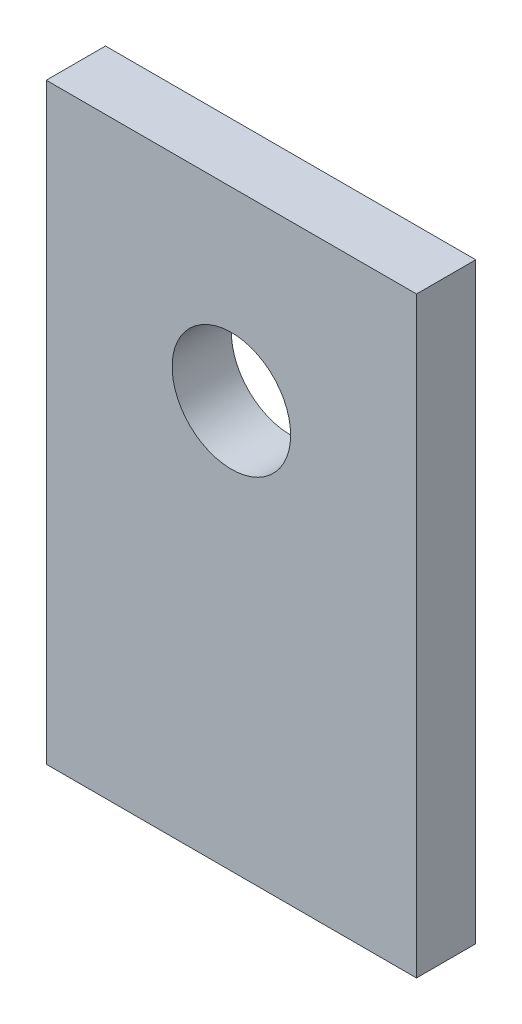
ISO-10303-21;
HEADER;
FILE_DESCRIPTION(('STEP AP214'),'2;1');
FILE_NAME('part.step','',(''),(''),'','','');
FILE_SCHEMA(('AUTOMOTIVE_DESIGN { 1 0 10303 214 1 1 1 1 }'));
ENDSEC;
DATA;
#1=APPLICATION_CONTEXT('core data for automotive mechanical design processes');
#2=APPLICATION_PROTOCOL_DEFINITION('international standard','automotive_design',2000,#1);
#3=PRODUCT_CONTEXT('',#1,'mechanical');
#4=PRODUCT('Part','Part','',(#3));
#5=PRODUCT_RELATED_PRODUCT_CATEGORY('part','',(#4));
#6=PRODUCT_DEFINITION_FORMATION('','',#4);
#7=PRODUCT_DEFINITION_CONTEXT('part definition',#1,'design');
#8=PRODUCT_DEFINITION('design','',#6,#7);
#9=PRODUCT_DEFINITION_SHAPE('','',#8);
#10=(LENGTH_UNIT() NAMED_UNIT(*) SI_UNIT(.MILLI.,.METRE.));
#11=(NAMED_UNIT(*) PLANE_ANGLE_UNIT() SI_UNIT($,.RADIAN.));
#12=(NAMED_UNIT(*) SI_UNIT($,.STERADIAN.) SOLID_ANGLE_UNIT());
#13=UNCERTAINTY_MEASURE_WITH_UNIT(LENGTH_MEASURE(1.E-05),#10,'distance_accuracy_value','');
#14=(GEOMETRIC_REPRESENTATION_CONTEXT(3) GLOBAL_UNCERTAINTY_ASSIGNED_CONTEXT((#13)) GLOBAL_UNIT_ASSIGNED_CONTEXT((#10,
#11,#12)) REPRESENTATION_CONTEXT('',''));
#15=CARTESIAN_POINT('',(0.,0.,0.));
#16=DIRECTION('',(0.,0.,1.));
#17=DIRECTION('',(1.,0.,0.));
#18=AXIS2_PLACEMENT_3D('',#15,#16,#17);
#19=CARTESIAN_POINT('',(0.,0.,4.));
#20=DIRECTION('',(0.,0.,1.));
#21=DIRECTION('',(1.,0.,0.));
#22=AXIS2_PLACEMENT_3D('',#19,#20,#21);
#23=PLANE('',#22);
#24=DIRECTION('',(0.,1.,0.));
#25=VECTOR('',#24,1.);
#26=CARTESIAN_POINT('',(12.5,20.,4.));
#27=LINE('',#26,#25);
#28=CARTESIAN_POINT('',(12.5,-20.,4.));
#29=VERTEX_POINT('',#28);
#30=CARTESIAN_POINT('',(12.5,20.,4.));
#31=VERTEX_POINT('',#30);
#32=EDGE_CURVE('E92',#29,#31,#27,.T.);
#33=ORIENTED_EDGE('',*,*,#32,.T.);
#34=DIRECTION('',(-1.,0.,0.));
#35=VECTOR('',#34,1.);
#36=CARTESIAN_POINT('',(-12.5,20.,4.));
#37=LINE('',#36,#35);
#38=CARTESIAN_POINT('',(-12.5,20.,4.));
#39=VERTEX_POINT('',#38);
#40=EDGE_CURVE('E87',#31,#39,#37,.T.);
#41=ORIENTED_EDGE('',*,*,#40,.T.);
#42=DIRECTION('',(0.,-1.,0.));
#43=VECTOR('',#42,1.);
#44=CARTESIAN_POINT('',(-12.5,20.,4.));
#45=LINE('',#44,#43);
#46=CARTESIAN_POINT('',(-12.5,-20.,4.));
#47=VERTEX_POINT('',#46);
#48=EDGE_CURVE('E90',#39,#47,#45,.T.);
#49=ORIENTED_EDGE('',*,*,#48,.T.);
#50=DIRECTION('',(1.,0.,0.));
#51=VECTOR('',#50,1.);
#52=CARTESIAN_POINT('',(-12.5,-20.,4.));
#53=LINE('',#52,#51);
#54=EDGE_CURVE('E57',#47,#29,#53,.T.);
#55=ORIENTED_EDGE('',*,*,#54,.T.);
#56=EDGE_LOOP('',(#33,#41,#49,#55));
#57=FACE_BOUND('',#56,.T.);
#58=CARTESIAN_POINT('',(0.,7.5,4.));
#59=DIRECTION('',(0.,0.,1.));
#60=DIRECTION('',(1.,0.,0.));
#61=AXIS2_PLACEMENT_3D('',#58,#59,#60);
#62=CIRCLE('',#61,4.);
#63=CARTESIAN_POINT('',(4.,7.5,4.));
#64=VERTEX_POINT('',#63);
#65=EDGE_CURVE('E112',#64,#64,#62,.T.);
#66=ORIENTED_EDGE('',*,*,#65,.F.);
#67=EDGE_LOOP('',(#66));
#68=FACE_BOUND('',#67,.T.);
#69=ADVANCED_FACE('F39',(#57,#68),#23,.T.);
#70=CARTESIAN_POINT('',(0.,0.,0.));
#71=DIRECTION('',(0.,0.,1.));
#72=DIRECTION('',(1.,0.,0.));
#73=AXIS2_PLACEMENT_3D('',#70,#71,#72);
#74=PLANE('',#73);
#75=DIRECTION('',(0.,1.,0.));
#76=VECTOR('',#75,1.);
#77=CARTESIAN_POINT('',(12.5,20.,0.));
#78=LINE('',#77,#76);
#79=CARTESIAN_POINT('',(12.5,-20.,0.));
#80=VERTEX_POINT('',#79);
#81=CARTESIAN_POINT('',(12.5,20.,0.));
#82=VERTEX_POINT('',#81);
#83=EDGE_CURVE('E108',#80,#82,#78,.T.);
#84=ORIENTED_EDGE('',*,*,#83,.F.);
#85=DIRECTION('',(1.,0.,0.));
#86=VECTOR('',#85,1.);
#87=CARTESIAN_POINT('',(-12.5,-20.,0.));
#88=LINE('',#87,#86);
#89=CARTESIAN_POINT('',(-12.5,-20.,0.));
#90=VERTEX_POINT('',#89);
#91=EDGE_CURVE('E80',#90,#80,#88,.T.);
#92=ORIENTED_EDGE('',*,*,#91,.F.);
#93=DIRECTION('',(0.,-1.,0.));
#94=VECTOR('',#93,1.);
#95=CARTESIAN_POINT('',(-12.5,20.,0.));
#96=LINE('',#95,#94);
#97=CARTESIAN_POINT('',(-12.5,20.,0.));
#98=VERTEX_POINT('',#97);
#99=EDGE_CURVE('E74',#98,#90,#96,.T.);
#100=ORIENTED_EDGE('',*,*,#99,.F.);
#101=DIRECTION('',(-1.,0.,0.));
#102=VECTOR('',#101,1.);
#103=CARTESIAN_POINT('',(-12.5,20.,0.));
#104=LINE('',#103,#102);
#105=EDGE_CURVE('E97',#82,#98,#104,.T.);
#106=ORIENTED_EDGE('',*,*,#105,.F.);
#107=EDGE_LOOP('',(#84,#92,#100,#106));
#108=FACE_BOUND('',#107,.T.);
#109=CARTESIAN_POINT('',(0.,7.5,0.));
#110=DIRECTION('',(0.,0.,1.));
#111=DIRECTION('',(1.,0.,0.));
#112=AXIS2_PLACEMENT_3D('',#109,#110,#111);
#113=CIRCLE('',#112,4.);
#114=CARTESIAN_POINT('',(4.,7.5,0.));
#115=VERTEX_POINT('',#114);
#116=EDGE_CURVE('E130',#115,#115,#113,.T.);
#117=ORIENTED_EDGE('',*,*,#116,.T.);
#118=EDGE_LOOP('',(#117));
#119=FACE_BOUND('',#118,.T.);
#120=ADVANCED_FACE('F125',(#108,#119),#74,.F.);
#121=CARTESIAN_POINT('',(12.5,20.,4.));
#122=DIRECTION('',(-1.,0.,0.));
#123=DIRECTION('',(0.,-1.,0.));
#124=AXIS2_PLACEMENT_3D('',#121,#122,#123);
#125=PLANE('',#124);
#126=ORIENTED_EDGE('',*,*,#83,.T.);
#127=DIRECTION('',(0.,0.,-1.));
#128=VECTOR('',#127,1.);
#129=CARTESIAN_POINT('',(12.5,20.,4.));
#130=LINE('',#129,#128);
#131=EDGE_CURVE('E11',#31,#82,#130,.T.);
#132=ORIENTED_EDGE('',*,*,#131,.F.);
#133=ORIENTED_EDGE('',*,*,#32,.F.);
#134=DIRECTION('',(0.,0.,-1.));
#135=VECTOR('',#134,1.);
#136=CARTESIAN_POINT('',(12.5,-20.,4.));
#137=LINE('',#136,#135);
#138=EDGE_CURVE('E104',#29,#80,#137,.T.);
#139=ORIENTED_EDGE('',*,*,#138,.T.);
#140=EDGE_LOOP('',(#126,#132,#133,#139));
#141=FACE_BOUND('',#140,.T.);
#142=ADVANCED_FACE('F41',(#141),#125,.F.);
#143=CARTESIAN_POINT('',(-12.5,20.,4.));
#144=DIRECTION('',(0.,-1.,0.));
#145=DIRECTION('',(0.,0.,-1.));
#146=AXIS2_PLACEMENT_3D('',#143,#144,#145);
#147=PLANE('',#146);
#148=ORIENTED_EDGE('',*,*,#105,.T.);
#149=DIRECTION('',(0.,0.,-1.));
#150=VECTOR('',#149,1.);
#151=CARTESIAN_POINT('',(-12.5,20.,4.));
#152=LINE('',#151,#150);
#153=EDGE_CURVE('E49',#39,#98,#152,.T.);
#154=ORIENTED_EDGE('',*,*,#153,.F.);
#155=ORIENTED_EDGE('',*,*,#40,.F.);
#156=ORIENTED_EDGE('',*,*,#131,.T.);
#157=EDGE_LOOP('',(#148,#154,#155,#156));
#158=FACE_BOUND('',#157,.T.);
#159=ADVANCED_FACE('F96',(#158),#147,.F.);
#160=CARTESIAN_POINT('',(-12.5,20.,4.));
#161=DIRECTION('',(1.,0.,0.));
#162=DIRECTION('',(0.,1.,0.));
#163=AXIS2_PLACEMENT_3D('',#160,#161,#162);
#164=PLANE('',#163);
#165=ORIENTED_EDGE('',*,*,#99,.T.);
#166=DIRECTION('',(0.,0.,-1.));
#167=VECTOR('',#166,1.);
#168=CARTESIAN_POINT('',(-12.5,-20.,4.));
#169=LINE('',#168,#167);
#170=EDGE_CURVE('E99',#47,#90,#169,.T.);
#171=ORIENTED_EDGE('',*,*,#170,.F.);
#172=ORIENTED_EDGE('',*,*,#48,.F.);
#173=ORIENTED_EDGE('',*,*,#153,.T.);
#174=EDGE_LOOP('',(#165,#171,#172,#173));
#175=FACE_BOUND('',#174,.T.);
#176=ADVANCED_FACE('F100',(#175),#164,.F.);
#177=CARTESIAN_POINT('',(-12.5,-20.,4.));
#178=DIRECTION('',(0.,1.,0.));
#179=DIRECTION('',(0.,0.,1.));
#180=AXIS2_PLACEMENT_3D('',#177,#178,#179);
#181=PLANE('',#180);
#182=ORIENTED_EDGE('',*,*,#91,.T.);
#183=ORIENTED_EDGE('',*,*,#138,.F.);
#184=ORIENTED_EDGE('',*,*,#54,.F.);
#185=ORIENTED_EDGE('',*,*,#170,.T.);
#186=EDGE_LOOP('',(#182,#183,#184,#185));
#187=FACE_BOUND('',#186,.T.);
#188=ADVANCED_FACE('F122',(#187),#181,.F.);
#189=CARTESIAN_POINT('',(0.,7.5,4.));
#190=DIRECTION('',(0.,0.,-1.));
#191=DIRECTION('',(-1.,0.,0.));
#192=AXIS2_PLACEMENT_3D('',#189,#190,#191);
#193=CYLINDRICAL_SURFACE('',#192,4.);
#194=ORIENTED_EDGE('',*,*,#65,.T.);
#195=EDGE_LOOP('',(#194));
#196=FACE_BOUND('',#195,.T.);
#197=ORIENTED_EDGE('',*,*,#116,.F.);
#198=EDGE_LOOP('',(#197));
#199=FACE_BOUND('',#198,.T.);
#200=ADVANCED_FACE('F138',(#196,#199),#193,.F.);
#201=CLOSED_SHELL('',(#69,#120,#142,#159,#176,#188,#200));
#202=MANIFOLD_SOLID_BREP('B2',#201);
#203=ADVANCED_BREP_SHAPE_REPRESENTATION('',(#18,#202),#14);
#204=SHAPE_DEFINITION_REPRESENTATION(#9,#203);
ENDSEC;
END-ISO-10303-21;
